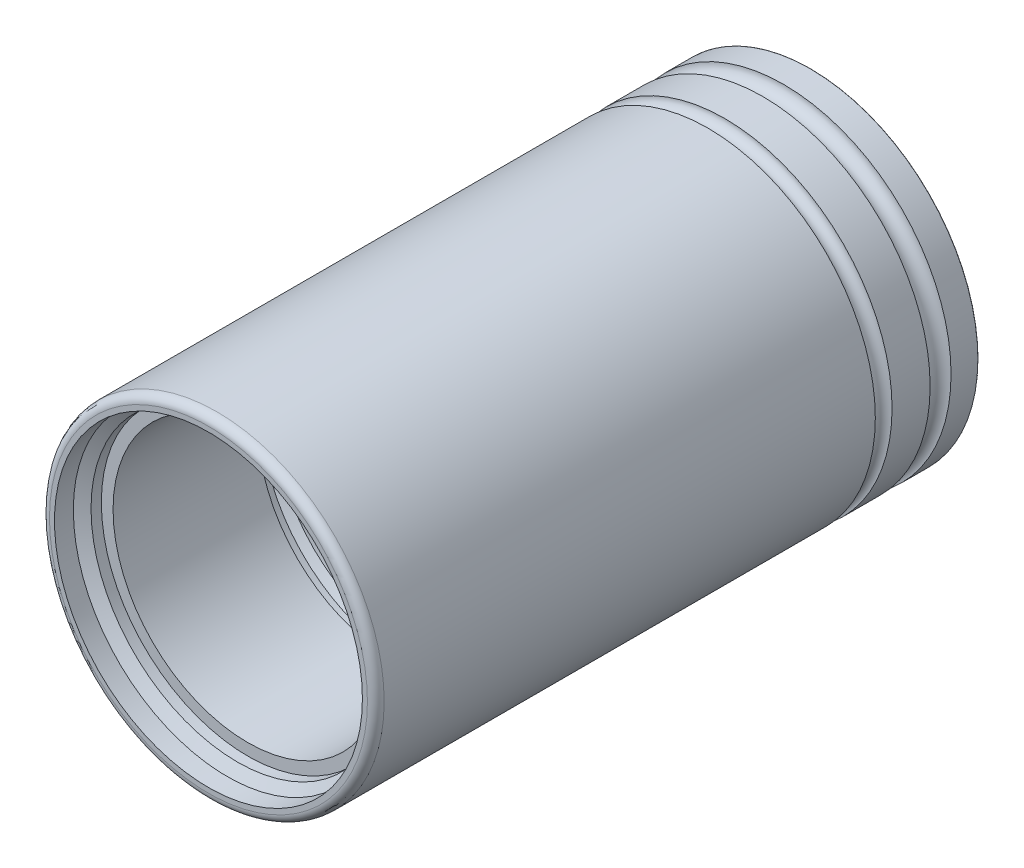
ISO-10303-21;
HEADER;
FILE_DESCRIPTION(('STEP AP214'),'2;1');
FILE_NAME('part.step','',(''),(''),'','','');
FILE_SCHEMA(('AUTOMOTIVE_DESIGN { 1 0 10303 214 1 1 1 1 }'));
ENDSEC;
DATA;
#1=APPLICATION_CONTEXT('core data for automotive mechanical design processes');
#2=APPLICATION_PROTOCOL_DEFINITION('international standard','automotive_design',2000,#1);
#3=PRODUCT_CONTEXT('',#1,'mechanical');
#4=PRODUCT('Part','Part','',(#3));
#5=PRODUCT_RELATED_PRODUCT_CATEGORY('part','',(#4));
#6=PRODUCT_DEFINITION_FORMATION('','',#4);
#7=PRODUCT_DEFINITION_CONTEXT('part definition',#1,'design');
#8=PRODUCT_DEFINITION('design','',#6,#7);
#9=PRODUCT_DEFINITION_SHAPE('','',#8);
#10=(LENGTH_UNIT() NAMED_UNIT(*) SI_UNIT(.MILLI.,.METRE.));
#11=(NAMED_UNIT(*) PLANE_ANGLE_UNIT() SI_UNIT($,.RADIAN.));
#12=(NAMED_UNIT(*) SI_UNIT($,.STERADIAN.) SOLID_ANGLE_UNIT());
#13=UNCERTAINTY_MEASURE_WITH_UNIT(LENGTH_MEASURE(1.E-05),#10,'distance_accuracy_value','');
#14=(GEOMETRIC_REPRESENTATION_CONTEXT(3) GLOBAL_UNCERTAINTY_ASSIGNED_CONTEXT((#13)) GLOBAL_UNIT_ASSIGNED_CONTEXT((#10,
#11,#12)) REPRESENTATION_CONTEXT('',''));
#15=CARTESIAN_POINT('',(0.,0.,0.));
#16=DIRECTION('',(0.,0.,1.));
#17=DIRECTION('',(1.,0.,0.));
#18=AXIS2_PLACEMENT_3D('',#15,#16,#17);
#19=CARTESIAN_POINT('',(0.,0.,-72.));
#20=DIRECTION('',(0.,0.,1.));
#21=DIRECTION('',(1.,0.,0.));
#22=AXIS2_PLACEMENT_3D('',#19,#20,#21);
#23=CYLINDRICAL_SURFACE('',#22,20.);
#24=CARTESIAN_POINT('',(0.,0.,-71.95));
#25=DIRECTION('',(0.,0.,1.));
#26=DIRECTION('',(1.,0.,0.));
#27=AXIS2_PLACEMENT_3D('',#24,#25,#26);
#28=CIRCLE('',#27,20.);
#29=CARTESIAN_POINT('',(20.,0.,-71.95));
#30=VERTEX_POINT('',#29);
#31=EDGE_CURVE('E46',#30,#30,#28,.T.);
#32=ORIENTED_EDGE('',*,*,#31,.T.);
#33=EDGE_LOOP('',(#32));
#34=FACE_BOUND('',#33,.T.);
#35=CARTESIAN_POINT('',(0.,0.,-68.75));
#36=DIRECTION('',(0.,0.,1.));
#37=DIRECTION('',(1.,0.,0.));
#38=AXIS2_PLACEMENT_3D('',#35,#36,#37);
#39=CIRCLE('',#38,20.);
#40=CARTESIAN_POINT('',(20.,0.,-68.75));
#41=VERTEX_POINT('',#40);
#42=EDGE_CURVE('E55',#41,#41,#39,.F.);
#43=ORIENTED_EDGE('',*,*,#42,.T.);
#44=EDGE_LOOP('',(#43));
#45=FACE_BOUND('',#44,.T.);
#46=ADVANCED_FACE('F33',(#34,#45),#23,.T.);
#47=CARTESIAN_POINT('',(0.,0.,-1.));
#48=DIRECTION('',(0.,0.,1.));
#49=DIRECTION('',(1.,0.,0.));
#50=AXIS2_PLACEMENT_3D('',#47,#48,#49);
#51=CIRCLE('',#50,20.);
#52=CARTESIAN_POINT('',(20.,0.,-1.));
#53=VERTEX_POINT('',#52);
#54=EDGE_CURVE('E159',#53,#53,#51,.F.);
#55=ORIENTED_EDGE('',*,*,#54,.T.);
#56=EDGE_LOOP('',(#55));
#57=FACE_BOUND('',#56,.T.);
#58=CARTESIAN_POINT('',(0.,0.,-59.7));
#59=DIRECTION('',(0.,0.,-1.));
#60=DIRECTION('',(-1.,0.,0.));
#61=AXIS2_PLACEMENT_3D('',#58,#59,#60);
#62=CIRCLE('',#61,20.);
#63=CARTESIAN_POINT('',(-20.,0.,-59.7));
#64=VERTEX_POINT('',#63);
#65=EDGE_CURVE('E53',#64,#64,#62,.F.);
#66=ORIENTED_EDGE('',*,*,#65,.T.);
#67=EDGE_LOOP('',(#66));
#68=FACE_BOUND('',#67,.T.);
#69=ADVANCED_FACE('F191',(#57,#68),#23,.T.);
#70=CARTESIAN_POINT('',(0.,0.,-72.));
#71=DIRECTION('',(0.,0.,1.));
#72=DIRECTION('',(1.,0.,0.));
#73=AXIS2_PLACEMENT_3D('',#70,#71,#72);
#74=PLANE('',#73);
#75=CARTESIAN_POINT('',(0.,0.,-72.));
#76=DIRECTION('',(0.,0.,1.));
#77=DIRECTION('',(1.,0.,0.));
#78=AXIS2_PLACEMENT_3D('',#75,#76,#77);
#79=CIRCLE('',#78,19.95);
#80=CARTESIAN_POINT('',(19.95,0.,-72.));
#81=VERTEX_POINT('',#80);
#82=EDGE_CURVE('E167',#81,#81,#79,.F.);
#83=ORIENTED_EDGE('',*,*,#82,.T.);
#84=EDGE_LOOP('',(#83));
#85=FACE_BOUND('',#84,.T.);
#86=CARTESIAN_POINT('',(0.,0.,-72.));
#87=DIRECTION('',(0.,0.,-1.));
#88=DIRECTION('',(-1.,0.,0.));
#89=AXIS2_PLACEMENT_3D('',#86,#87,#88);
#90=CIRCLE('',#89,15.95);
#91=CARTESIAN_POINT('',(-15.95,0.,-72.));
#92=VERTEX_POINT('',#91);
#93=EDGE_CURVE('E80',#92,#92,#90,.T.);
#94=ORIENTED_EDGE('',*,*,#93,.F.);
#95=EDGE_LOOP('',(#94));
#96=FACE_BOUND('',#95,.T.);
#97=ADVANCED_FACE('F197',(#85,#96),#74,.F.);
#98=CARTESIAN_POINT('',(0.,0.,-72.));
#99=DIRECTION('',(0.,0.,1.));
#100=DIRECTION('',(1.,0.,0.));
#101=AXIS2_PLACEMENT_3D('',#98,#99,#100);
#102=CIRCLE('',#101,10.8);
#103=CARTESIAN_POINT('',(10.8,0.,-72.));
#104=VERTEX_POINT('',#103);
#105=EDGE_CURVE('E170',#104,#104,#102,.T.);
#106=ORIENTED_EDGE('',*,*,#105,.T.);
#107=EDGE_LOOP('',(#106));
#108=FACE_BOUND('',#107,.T.);
#109=CARTESIAN_POINT('',(0.,0.,-72.));
#110=DIRECTION('',(0.,0.,-1.));
#111=DIRECTION('',(-1.,0.,0.));
#112=AXIS2_PLACEMENT_3D('',#109,#110,#111);
#113=CIRCLE('',#112,13.0475886032519);
#114=CARTESIAN_POINT('',(-13.0475886032519,0.,-72.));
#115=VERTEX_POINT('',#114);
#116=EDGE_CURVE('E60',#115,#115,#113,.T.);
#117=ORIENTED_EDGE('',*,*,#116,.T.);
#118=EDGE_LOOP('',(#117));
#119=FACE_BOUND('',#118,.T.);
#120=ADVANCED_FACE('F341',(#108,#119),#74,.F.);
#121=CARTESIAN_POINT('',(0.,0.,-72.));
#122=DIRECTION('',(0.,0.,-1.));
#123=DIRECTION('',(-1.,0.,0.));
#124=AXIS2_PLACEMENT_3D('',#121,#122,#123);
#125=CYLINDRICAL_SURFACE('',#124,17.5);
#126=CARTESIAN_POINT('',(0.,0.,-4.7));
#127=DIRECTION('',(0.,0.,-1.));
#128=DIRECTION('',(-1.,0.,0.));
#129=AXIS2_PLACEMENT_3D('',#126,#127,#128);
#130=CIRCLE('',#129,17.5);
#131=CARTESIAN_POINT('',(-17.5,0.,-4.7));
#132=VERTEX_POINT('',#131);
#133=EDGE_CURVE('E153',#132,#132,#130,.T.);
#134=ORIENTED_EDGE('',*,*,#133,.T.);
#135=EDGE_LOOP('',(#134));
#136=FACE_BOUND('',#135,.T.);
#137=CARTESIAN_POINT('',(0.,0.,-3.46602540378444));
#138=DIRECTION('',(0.,0.,1.));
#139=DIRECTION('',(1.,0.,0.));
#140=AXIS2_PLACEMENT_3D('',#137,#138,#139);
#141=CIRCLE('',#140,17.5);
#142=CARTESIAN_POINT('',(17.5,0.,-3.46602540378444));
#143=VERTEX_POINT('',#142);
#144=EDGE_CURVE('E90',#143,#143,#141,.T.);
#145=ORIENTED_EDGE('',*,*,#144,.T.);
#146=EDGE_LOOP('',(#145));
#147=FACE_BOUND('',#146,.T.);
#148=ADVANCED_FACE('F338',(#136,#147),#125,.F.);
#149=CARTESIAN_POINT('',(0.,0.,0.));
#150=DIRECTION('',(0.,0.,1.));
#151=DIRECTION('',(1.,0.,0.));
#152=AXIS2_PLACEMENT_3D('',#149,#150,#151);
#153=PLANE('',#152);
#154=CARTESIAN_POINT('',(0.,0.,0.));
#155=DIRECTION('',(0.,0.,1.));
#156=DIRECTION('',(1.,0.,0.));
#157=AXIS2_PLACEMENT_3D('',#154,#155,#156);
#158=CIRCLE('',#157,18.4);
#159=CARTESIAN_POINT('',(18.4,0.,0.));
#160=VERTEX_POINT('',#159);
#161=EDGE_CURVE('E83',#160,#160,#158,.T.);
#162=ORIENTED_EDGE('',*,*,#161,.F.);
#163=EDGE_LOOP('',(#162));
#164=FACE_BOUND('',#163,.T.);
#165=CARTESIAN_POINT('',(0.,0.,0.));
#166=DIRECTION('',(0.,0.,1.));
#167=DIRECTION('',(1.,0.,0.));
#168=AXIS2_PLACEMENT_3D('',#165,#166,#167);
#169=CIRCLE('',#168,19.);
#170=CARTESIAN_POINT('',(19.,0.,0.));
#171=VERTEX_POINT('',#170);
#172=EDGE_CURVE('E156',#171,#171,#169,.T.);
#173=ORIENTED_EDGE('',*,*,#172,.T.);
#174=EDGE_LOOP('',(#173));
#175=FACE_BOUND('',#174,.T.);
#176=ADVANCED_FACE('F336',(#164,#175),#153,.T.);
#177=CARTESIAN_POINT('',(0.,17.5,-4.7));
#178=DIRECTION('',(0.,0.,-1.));
#179=DIRECTION('',(-1.,0.,0.));
#180=AXIS2_PLACEMENT_3D('',#177,#178,#179);
#181=PLANE('',#180);
#182=ORIENTED_EDGE('',*,*,#133,.F.);
#183=EDGE_LOOP('',(#182));
#184=FACE_BOUND('',#183,.T.);
#185=CARTESIAN_POINT('',(0.,0.,-4.7));
#186=DIRECTION('',(0.,0.,-1.));
#187=DIRECTION('',(-1.,0.,0.));
#188=AXIS2_PLACEMENT_3D('',#185,#186,#187);
#189=CIRCLE('',#188,16.1);
#190=CARTESIAN_POINT('',(-16.1,0.,-4.7));
#191=VERTEX_POINT('',#190);
#192=EDGE_CURVE('E150',#191,#191,#189,.T.);
#193=ORIENTED_EDGE('',*,*,#192,.T.);
#194=EDGE_LOOP('',(#193));
#195=FACE_BOUND('',#194,.T.);
#196=ADVANCED_FACE('F332',(#184,#195),#181,.F.);
#197=CARTESIAN_POINT('',(0.,0.,-72.));
#198=DIRECTION('',(0.,0.,-1.));
#199=DIRECTION('',(-1.,0.,0.));
#200=AXIS2_PLACEMENT_3D('',#197,#198,#199);
#201=CYLINDRICAL_SURFACE('',#200,16.1);
#202=ORIENTED_EDGE('',*,*,#192,.F.);
#203=EDGE_LOOP('',(#202));
#204=FACE_BOUND('',#203,.T.);
#205=CARTESIAN_POINT('',(0.,0.,-22.));
#206=DIRECTION('',(0.,0.,-1.));
#207=DIRECTION('',(-1.,0.,0.));
#208=AXIS2_PLACEMENT_3D('',#205,#206,#207);
#209=CIRCLE('',#208,16.1);
#210=CARTESIAN_POINT('',(-16.1,0.,-22.));
#211=VERTEX_POINT('',#210);
#212=EDGE_CURVE('E147',#211,#211,#209,.T.);
#213=ORIENTED_EDGE('',*,*,#212,.T.);
#214=EDGE_LOOP('',(#213));
#215=FACE_BOUND('',#214,.T.);
#216=ADVANCED_FACE('F328',(#204,#215),#201,.F.);
#217=CARTESIAN_POINT('',(0.,16.1,-22.));
#218=DIRECTION('',(0.,0.,1.));
#219=DIRECTION('',(1.,0.,0.));
#220=AXIS2_PLACEMENT_3D('',#217,#218,#219);
#221=PLANE('',#220);
#222=ORIENTED_EDGE('',*,*,#212,.F.);
#223=EDGE_LOOP('',(#222));
#224=FACE_BOUND('',#223,.T.);
#225=CARTESIAN_POINT('',(0.,0.,-22.));
#226=DIRECTION('',(0.,0.,-1.));
#227=DIRECTION('',(-1.,0.,0.));
#228=AXIS2_PLACEMENT_3D('',#225,#226,#227);
#229=CIRCLE('',#228,17.1);
#230=CARTESIAN_POINT('',(-17.1,0.,-22.));
#231=VERTEX_POINT('',#230);
#232=EDGE_CURVE('E144',#231,#231,#229,.T.);
#233=ORIENTED_EDGE('',*,*,#232,.T.);
#234=EDGE_LOOP('',(#233));
#235=FACE_BOUND('',#234,.T.);
#236=ADVANCED_FACE('F324',(#224,#235),#221,.F.);
#237=CARTESIAN_POINT('',(0.,0.,-72.));
#238=DIRECTION('',(0.,0.,-1.));
#239=DIRECTION('',(-1.,0.,0.));
#240=AXIS2_PLACEMENT_3D('',#237,#238,#239);
#241=CYLINDRICAL_SURFACE('',#240,17.1);
#242=ORIENTED_EDGE('',*,*,#232,.F.);
#243=EDGE_LOOP('',(#242));
#244=FACE_BOUND('',#243,.T.);
#245=CARTESIAN_POINT('',(0.,0.,-23.4));
#246=DIRECTION('',(0.,0.,-1.));
#247=DIRECTION('',(-1.,0.,0.));
#248=AXIS2_PLACEMENT_3D('',#245,#246,#247);
#249=CIRCLE('',#248,17.1);
#250=CARTESIAN_POINT('',(-17.1,0.,-23.4));
#251=VERTEX_POINT('',#250);
#252=EDGE_CURVE('E141',#251,#251,#249,.T.);
#253=ORIENTED_EDGE('',*,*,#252,.T.);
#254=EDGE_LOOP('',(#253));
#255=FACE_BOUND('',#254,.T.);
#256=ADVANCED_FACE('F320',(#244,#255),#241,.F.);
#257=CARTESIAN_POINT('',(0.,0.,-23.9773502691896));
#258=DIRECTION('',(0.,0.,1.));
#259=DIRECTION('',(1.,0.,0.));
#260=AXIS2_PLACEMENT_3D('',#257,#258,#259);
#261=CONICAL_SURFACE('',#260,16.1,1.0471975511966);
#262=ORIENTED_EDGE('',*,*,#252,.F.);
#263=EDGE_LOOP('',(#262));
#264=FACE_BOUND('',#263,.T.);
#265=CARTESIAN_POINT('',(0.,0.,-23.9773502691896));
#266=DIRECTION('',(0.,0.,-1.));
#267=DIRECTION('',(-1.,0.,0.));
#268=AXIS2_PLACEMENT_3D('',#265,#266,#267);
#269=CIRCLE('',#268,16.1);
#270=CARTESIAN_POINT('',(-16.1,0.,-23.9773502691896));
#271=VERTEX_POINT('',#270);
#272=EDGE_CURVE('E138',#271,#271,#269,.T.);
#273=ORIENTED_EDGE('',*,*,#272,.T.);
#274=EDGE_LOOP('',(#273));
#275=FACE_BOUND('',#274,.T.);
#276=ADVANCED_FACE('F316',(#264,#275),#261,.F.);
#277=CARTESIAN_POINT('',(0.,0.,-72.));
#278=DIRECTION('',(0.,0.,-1.));
#279=DIRECTION('',(-1.,0.,0.));
#280=AXIS2_PLACEMENT_3D('',#277,#278,#279);
#281=CYLINDRICAL_SURFACE('',#280,16.1);
#282=ORIENTED_EDGE('',*,*,#272,.F.);
#283=EDGE_LOOP('',(#282));
#284=FACE_BOUND('',#283,.T.);
#285=CARTESIAN_POINT('',(0.,0.,-30.3));
#286=DIRECTION('',(0.,0.,-1.));
#287=DIRECTION('',(-1.,0.,0.));
#288=AXIS2_PLACEMENT_3D('',#285,#286,#287);
#289=CIRCLE('',#288,16.1);
#290=CARTESIAN_POINT('',(-16.1,0.,-30.3));
#291=VERTEX_POINT('',#290);
#292=EDGE_CURVE('E135',#291,#291,#289,.T.);
#293=ORIENTED_EDGE('',*,*,#292,.T.);
#294=EDGE_LOOP('',(#293));
#295=FACE_BOUND('',#294,.T.);
#296=ADVANCED_FACE('F312',(#284,#295),#281,.F.);
#297=CARTESIAN_POINT('',(0.,16.1,-30.3));
#298=DIRECTION('',(0.,0.,1.));
#299=DIRECTION('',(1.,0.,0.));
#300=AXIS2_PLACEMENT_3D('',#297,#298,#299);
#301=PLANE('',#300);
#302=ORIENTED_EDGE('',*,*,#292,.F.);
#303=EDGE_LOOP('',(#302));
#304=FACE_BOUND('',#303,.T.);
#305=CARTESIAN_POINT('',(0.,0.,-30.3));
#306=DIRECTION('',(0.,0.,-1.));
#307=DIRECTION('',(-1.,0.,0.));
#308=AXIS2_PLACEMENT_3D('',#305,#306,#307);
#309=CIRCLE('',#308,18.);
#310=CARTESIAN_POINT('',(-18.,0.,-30.3));
#311=VERTEX_POINT('',#310);
#312=EDGE_CURVE('E132',#311,#311,#309,.T.);
#313=ORIENTED_EDGE('',*,*,#312,.T.);
#314=EDGE_LOOP('',(#313));
#315=FACE_BOUND('',#314,.T.);
#316=ADVANCED_FACE('F308',(#304,#315),#301,.F.);
#317=CARTESIAN_POINT('',(0.,0.,-72.));
#318=DIRECTION('',(0.,0.,-1.));
#319=DIRECTION('',(-1.,0.,0.));
#320=AXIS2_PLACEMENT_3D('',#317,#318,#319);
#321=CYLINDRICAL_SURFACE('',#320,18.);
#322=ORIENTED_EDGE('',*,*,#312,.F.);
#323=EDGE_LOOP('',(#322));
#324=FACE_BOUND('',#323,.T.);
#325=CARTESIAN_POINT('',(0.,0.,-33.5));
#326=DIRECTION('',(0.,0.,-1.));
#327=DIRECTION('',(-1.,0.,0.));
#328=AXIS2_PLACEMENT_3D('',#325,#326,#327);
#329=CIRCLE('',#328,18.);
#330=CARTESIAN_POINT('',(-18.,0.,-33.5));
#331=VERTEX_POINT('',#330);
#332=EDGE_CURVE('E129',#331,#331,#329,.T.);
#333=ORIENTED_EDGE('',*,*,#332,.T.);
#334=EDGE_LOOP('',(#333));
#335=FACE_BOUND('',#334,.T.);
#336=ADVANCED_FACE('F304',(#324,#335),#321,.F.);
#337=CARTESIAN_POINT('',(0.,16.1,-33.5));
#338=DIRECTION('',(0.,0.,-1.));
#339=DIRECTION('',(-1.,0.,0.));
#340=AXIS2_PLACEMENT_3D('',#337,#338,#339);
#341=PLANE('',#340);
#342=ORIENTED_EDGE('',*,*,#332,.F.);
#343=EDGE_LOOP('',(#342));
#344=FACE_BOUND('',#343,.T.);
#345=CARTESIAN_POINT('',(0.,0.,-33.5));
#346=DIRECTION('',(0.,0.,-1.));
#347=DIRECTION('',(-1.,0.,0.));
#348=AXIS2_PLACEMENT_3D('',#345,#346,#347);
#349=CIRCLE('',#348,16.1);
#350=CARTESIAN_POINT('',(-16.1,0.,-33.5));
#351=VERTEX_POINT('',#350);
#352=EDGE_CURVE('E126',#351,#351,#349,.T.);
#353=ORIENTED_EDGE('',*,*,#352,.T.);
#354=EDGE_LOOP('',(#353));
#355=FACE_BOUND('',#354,.T.);
#356=ADVANCED_FACE('F300',(#344,#355),#341,.F.);
#357=CARTESIAN_POINT('',(0.,0.,-72.));
#358=DIRECTION('',(0.,0.,-1.));
#359=DIRECTION('',(-1.,0.,0.));
#360=AXIS2_PLACEMENT_3D('',#357,#358,#359);
#361=CYLINDRICAL_SURFACE('',#360,16.1);
#362=ORIENTED_EDGE('',*,*,#352,.F.);
#363=EDGE_LOOP('',(#362));
#364=FACE_BOUND('',#363,.T.);
#365=CARTESIAN_POINT('',(0.,0.,-47.));
#366=DIRECTION('',(0.,0.,-1.));
#367=DIRECTION('',(-1.,0.,0.));
#368=AXIS2_PLACEMENT_3D('',#365,#366,#367);
#369=CIRCLE('',#368,16.1);
#370=CARTESIAN_POINT('',(-16.1,0.,-47.));
#371=VERTEX_POINT('',#370);
#372=EDGE_CURVE('E123',#371,#371,#369,.T.);
#373=ORIENTED_EDGE('',*,*,#372,.T.);
#374=EDGE_LOOP('',(#373));
#375=FACE_BOUND('',#374,.T.);
#376=ADVANCED_FACE('F296',(#364,#375),#361,.F.);
#377=CARTESIAN_POINT('',(0.,16.1,-47.));
#378=DIRECTION('',(0.,0.,-1.));
#379=DIRECTION('',(-1.,0.,0.));
#380=AXIS2_PLACEMENT_3D('',#377,#378,#379);
#381=PLANE('',#380);
#382=ORIENTED_EDGE('',*,*,#372,.F.);
#383=EDGE_LOOP('',(#382));
#384=FACE_BOUND('',#383,.T.);
#385=CARTESIAN_POINT('',(0.,0.,-47.));
#386=DIRECTION('',(0.,0.,-1.));
#387=DIRECTION('',(-1.,0.,0.));
#388=AXIS2_PLACEMENT_3D('',#385,#386,#387);
#389=CIRCLE('',#388,6.);
#390=CARTESIAN_POINT('',(-6.,0.,-47.));
#391=VERTEX_POINT('',#390);
#392=EDGE_CURVE('E120',#391,#391,#389,.T.);
#393=ORIENTED_EDGE('',*,*,#392,.T.);
#394=EDGE_LOOP('',(#393));
#395=FACE_BOUND('',#394,.T.);
#396=ADVANCED_FACE('F292',(#384,#395),#381,.F.);
#397=CARTESIAN_POINT('',(0.,0.,-72.));
#398=DIRECTION('',(0.,0.,-1.));
#399=DIRECTION('',(-1.,0.,0.));
#400=AXIS2_PLACEMENT_3D('',#397,#398,#399);
#401=CYLINDRICAL_SURFACE('',#400,6.);
#402=CARTESIAN_POINT('',(0.,0.,-48.95));
#403=DIRECTION('',(0.,0.,1.));
#404=DIRECTION('',(1.,0.,0.));
#405=AXIS2_PLACEMENT_3D('',#402,#403,#404);
#406=CIRCLE('',#405,6.);
#407=CARTESIAN_POINT('',(6.,0.,-48.95));
#408=VERTEX_POINT('',#407);
#409=EDGE_CURVE('E41',#408,#408,#406,.F.);
#410=ORIENTED_EDGE('',*,*,#409,.T.);
#411=EDGE_LOOP('',(#410));
#412=FACE_BOUND('',#411,.T.);
#413=ORIENTED_EDGE('',*,*,#392,.F.);
#414=EDGE_LOOP('',(#413));
#415=FACE_BOUND('',#414,.T.);
#416=ADVANCED_FACE('F289',(#412,#415),#401,.F.);
#417=CARTESIAN_POINT('',(0.,6.,-49.));
#418=DIRECTION('',(0.,0.,1.));
#419=DIRECTION('',(1.,0.,0.));
#420=AXIS2_PLACEMENT_3D('',#417,#418,#419);
#421=PLANE('',#420);
#422=CARTESIAN_POINT('',(0.,0.,-49.));
#423=DIRECTION('',(0.,0.,1.));
#424=DIRECTION('',(1.,0.,0.));
#425=AXIS2_PLACEMENT_3D('',#422,#423,#424);
#426=CIRCLE('',#425,6.05);
#427=CARTESIAN_POINT('',(6.05,0.,-49.));
#428=VERTEX_POINT('',#427);
#429=EDGE_CURVE('E10',#428,#428,#426,.T.);
#430=ORIENTED_EDGE('',*,*,#429,.T.);
#431=EDGE_LOOP('',(#430));
#432=FACE_BOUND('',#431,.T.);
#433=CARTESIAN_POINT('',(0.,0.,-49.));
#434=DIRECTION('',(0.,0.,-1.));
#435=DIRECTION('',(-1.,0.,0.));
#436=AXIS2_PLACEMENT_3D('',#433,#434,#435);
#437=CIRCLE('',#436,9.5);
#438=CARTESIAN_POINT('',(-9.5,0.,-49.));
#439=VERTEX_POINT('',#438);
#440=EDGE_CURVE('E117',#439,#439,#437,.T.);
#441=ORIENTED_EDGE('',*,*,#440,.T.);
#442=EDGE_LOOP('',(#441));
#443=FACE_BOUND('',#442,.T.);
#444=ADVANCED_FACE('F285',(#432,#443),#421,.F.);
#445=CARTESIAN_POINT('',(0.,0.,-72.));
#446=DIRECTION('',(0.,0.,-1.));
#447=DIRECTION('',(-1.,0.,0.));
#448=AXIS2_PLACEMENT_3D('',#445,#446,#447);
#449=CYLINDRICAL_SURFACE('',#448,9.5);
#450=ORIENTED_EDGE('',*,*,#440,.F.);
#451=EDGE_LOOP('',(#450));
#452=FACE_BOUND('',#451,.T.);
#453=CARTESIAN_POINT('',(0.,0.,-52.8));
#454=DIRECTION('',(0.,0.,-1.));
#455=DIRECTION('',(-1.,0.,0.));
#456=AXIS2_PLACEMENT_3D('',#453,#454,#455);
#457=CIRCLE('',#456,9.5);
#458=CARTESIAN_POINT('',(-9.5,0.,-52.8));
#459=VERTEX_POINT('',#458);
#460=EDGE_CURVE('E114',#459,#459,#457,.T.);
#461=ORIENTED_EDGE('',*,*,#460,.T.);
#462=EDGE_LOOP('',(#461));
#463=FACE_BOUND('',#462,.T.);
#464=ADVANCED_FACE('F281',(#452,#463),#449,.F.);
#465=CARTESIAN_POINT('',(0.,0.,-53.4));
#466=DIRECTION('',(0.,0.,-1.));
#467=DIRECTION('',(-1.,0.,0.));
#468=AXIS2_PLACEMENT_3D('',#465,#466,#467);
#469=TOROIDAL_SURFACE('',#468,9.5,0.600000000000003);
#470=ORIENTED_EDGE('',*,*,#460,.F.);
#471=EDGE_LOOP('',(#470));
#472=FACE_BOUND('',#471,.T.);
#473=CARTESIAN_POINT('',(0.,0.,-54.));
#474=DIRECTION('',(0.,0.,-1.));
#475=DIRECTION('',(-1.,0.,0.));
#476=AXIS2_PLACEMENT_3D('',#473,#474,#475);
#477=CIRCLE('',#476,9.5);
#478=CARTESIAN_POINT('',(-9.5,0.,-54.));
#479=VERTEX_POINT('',#478);
#480=EDGE_CURVE('E111',#479,#479,#477,.T.);
#481=ORIENTED_EDGE('',*,*,#480,.T.);
#482=EDGE_LOOP('',(#481));
#483=FACE_BOUND('',#482,.T.);
#484=ADVANCED_FACE('F277',(#472,#483),#469,.F.);
#485=CARTESIAN_POINT('',(0.,0.,-72.));
#486=DIRECTION('',(0.,0.,-1.));
#487=DIRECTION('',(-1.,0.,0.));
#488=AXIS2_PLACEMENT_3D('',#485,#486,#487);
#489=CYLINDRICAL_SURFACE('',#488,9.5);
#490=ORIENTED_EDGE('',*,*,#480,.F.);
#491=EDGE_LOOP('',(#490));
#492=FACE_BOUND('',#491,.T.);
#493=CARTESIAN_POINT('',(0.,0.,-55.5));
#494=DIRECTION('',(0.,0.,-1.));
#495=DIRECTION('',(-1.,0.,0.));
#496=AXIS2_PLACEMENT_3D('',#493,#494,#495);
#497=CIRCLE('',#496,9.5);
#498=CARTESIAN_POINT('',(-9.5,0.,-55.5));
#499=VERTEX_POINT('',#498);
#500=EDGE_CURVE('E108',#499,#499,#497,.T.);
#501=ORIENTED_EDGE('',*,*,#500,.T.);
#502=EDGE_LOOP('',(#501));
#503=FACE_BOUND('',#502,.T.);
#504=ADVANCED_FACE('F273',(#492,#503),#489,.F.);
#505=CARTESIAN_POINT('',(0.,9.5,-55.5));
#506=DIRECTION('',(0.,0.,1.));
#507=DIRECTION('',(1.,0.,0.));
#508=AXIS2_PLACEMENT_3D('',#505,#506,#507);
#509=PLANE('',#508);
#510=ORIENTED_EDGE('',*,*,#500,.F.);
#511=EDGE_LOOP('',(#510));
#512=FACE_BOUND('',#511,.T.);
#513=CARTESIAN_POINT('',(0.,0.,-55.5));
#514=DIRECTION('',(0.,0.,-1.));
#515=DIRECTION('',(-1.,0.,0.));
#516=AXIS2_PLACEMENT_3D('',#513,#514,#515);
#517=CIRCLE('',#516,10.75);
#518=CARTESIAN_POINT('',(-10.75,0.,-55.5));
#519=VERTEX_POINT('',#518);
#520=EDGE_CURVE('E105',#519,#519,#517,.T.);
#521=ORIENTED_EDGE('',*,*,#520,.T.);
#522=EDGE_LOOP('',(#521));
#523=FACE_BOUND('',#522,.T.);
#524=ADVANCED_FACE('F269',(#512,#523),#509,.F.);
#525=CARTESIAN_POINT('',(0.,0.,-72.));
#526=DIRECTION('',(0.,0.,-1.));
#527=DIRECTION('',(-1.,0.,0.));
#528=AXIS2_PLACEMENT_3D('',#525,#526,#527);
#529=CYLINDRICAL_SURFACE('',#528,10.75);
#530=ORIENTED_EDGE('',*,*,#520,.F.);
#531=EDGE_LOOP('',(#530));
#532=FACE_BOUND('',#531,.T.);
#533=CARTESIAN_POINT('',(0.,0.,-67.));
#534=DIRECTION('',(0.,0.,-1.));
#535=DIRECTION('',(-1.,0.,0.));
#536=AXIS2_PLACEMENT_3D('',#533,#534,#535);
#537=CIRCLE('',#536,10.75);
#538=CARTESIAN_POINT('',(-10.75,0.,-67.));
#539=VERTEX_POINT('',#538);
#540=EDGE_CURVE('E102',#539,#539,#537,.T.);
#541=ORIENTED_EDGE('',*,*,#540,.T.);
#542=EDGE_LOOP('',(#541));
#543=FACE_BOUND('',#542,.T.);
#544=ADVANCED_FACE('F265',(#532,#543),#529,.F.);
#545=CARTESIAN_POINT('',(0.,10.75,-67.));
#546=DIRECTION('',(0.,0.,1.));
#547=DIRECTION('',(1.,0.,0.));
#548=AXIS2_PLACEMENT_3D('',#545,#546,#547);
#549=PLANE('',#548);
#550=ORIENTED_EDGE('',*,*,#540,.F.);
#551=EDGE_LOOP('',(#550));
#552=FACE_BOUND('',#551,.T.);
#553=CARTESIAN_POINT('',(0.,0.,-67.));
#554=DIRECTION('',(0.,0.,-1.));
#555=DIRECTION('',(-1.,0.,0.));
#556=AXIS2_PLACEMENT_3D('',#553,#554,#555);
#557=CIRCLE('',#556,12.4);
#558=CARTESIAN_POINT('',(-12.4,0.,-67.));
#559=VERTEX_POINT('',#558);
#560=EDGE_CURVE('E99',#559,#559,#557,.T.);
#561=ORIENTED_EDGE('',*,*,#560,.T.);
#562=EDGE_LOOP('',(#561));
#563=FACE_BOUND('',#562,.T.);
#564=ADVANCED_FACE('F261',(#552,#563),#549,.F.);
#565=CARTESIAN_POINT('',(0.,0.,-72.));
#566=DIRECTION('',(0.,0.,-1.));
#567=DIRECTION('',(-1.,0.,0.));
#568=AXIS2_PLACEMENT_3D('',#565,#566,#567);
#569=CYLINDRICAL_SURFACE('',#568,12.4);
#570=ORIENTED_EDGE('',*,*,#560,.F.);
#571=EDGE_LOOP('',(#570));
#572=FACE_BOUND('',#571,.T.);
#573=CARTESIAN_POINT('',(0.,0.,-70.));
#574=DIRECTION('',(0.,0.,-1.));
#575=DIRECTION('',(-1.,0.,0.));
#576=AXIS2_PLACEMENT_3D('',#573,#574,#575);
#577=CIRCLE('',#576,12.4);
#578=CARTESIAN_POINT('',(-12.4,0.,-70.));
#579=VERTEX_POINT('',#578);
#580=EDGE_CURVE('E96',#579,#579,#577,.T.);
#581=ORIENTED_EDGE('',*,*,#580,.T.);
#582=EDGE_LOOP('',(#581));
#583=FACE_BOUND('',#582,.T.);
#584=ADVANCED_FACE('F257',(#572,#583),#569,.F.);
#585=CARTESIAN_POINT('',(0.,12.4,-70.));
#586=DIRECTION('',(0.,0.,-1.));
#587=DIRECTION('',(-1.,0.,0.));
#588=AXIS2_PLACEMENT_3D('',#585,#586,#587);
#589=PLANE('',#588);
#590=ORIENTED_EDGE('',*,*,#580,.F.);
#591=EDGE_LOOP('',(#590));
#592=FACE_BOUND('',#591,.T.);
#593=CARTESIAN_POINT('',(0.,0.,-70.));
#594=DIRECTION('',(0.,0.,-1.));
#595=DIRECTION('',(-1.,0.,0.));
#596=AXIS2_PLACEMENT_3D('',#593,#594,#595);
#597=CIRCLE('',#596,10.75);
#598=CARTESIAN_POINT('',(-10.75,0.,-70.));
#599=VERTEX_POINT('',#598);
#600=EDGE_CURVE('E93',#599,#599,#597,.T.);
#601=ORIENTED_EDGE('',*,*,#600,.T.);
#602=EDGE_LOOP('',(#601));
#603=FACE_BOUND('',#602,.T.);
#604=ADVANCED_FACE('F253',(#592,#603),#589,.F.);
#605=CARTESIAN_POINT('',(0.,0.,-72.));
#606=DIRECTION('',(0.,0.,-1.));
#607=DIRECTION('',(-1.,0.,0.));
#608=AXIS2_PLACEMENT_3D('',#605,#606,#607);
#609=CYLINDRICAL_SURFACE('',#608,10.75);
#610=CARTESIAN_POINT('',(0.,0.,-71.95));
#611=DIRECTION('',(0.,0.,1.));
#612=DIRECTION('',(1.,0.,0.));
#613=AXIS2_PLACEMENT_3D('',#610,#611,#612);
#614=CIRCLE('',#613,10.75);
#615=CARTESIAN_POINT('',(10.75,0.,-71.95));
#616=VERTEX_POINT('',#615);
#617=EDGE_CURVE('E162',#616,#616,#614,.F.);
#618=ORIENTED_EDGE('',*,*,#617,.T.);
#619=EDGE_LOOP('',(#618));
#620=FACE_BOUND('',#619,.T.);
#621=ORIENTED_EDGE('',*,*,#600,.F.);
#622=EDGE_LOOP('',(#621));
#623=FACE_BOUND('',#622,.T.);
#624=ADVANCED_FACE('F249',(#620,#623),#609,.F.);
#625=CARTESIAN_POINT('',(0.,0.,-3.46602540378444));
#626=DIRECTION('',(0.,0.,1.));
#627=DIRECTION('',(1.,0.,0.));
#628=AXIS2_PLACEMENT_3D('',#625,#626,#627);
#629=CONICAL_SURFACE('',#628,17.5,1.0471975511966);
#630=CARTESIAN_POINT('',(0.,0.,-2.6));
#631=DIRECTION('',(0.,0.,1.));
#632=DIRECTION('',(1.,0.,0.));
#633=AXIS2_PLACEMENT_3D('',#630,#631,#632);
#634=CIRCLE('',#633,19.);
#635=CARTESIAN_POINT('',(19.,0.,-2.6));
#636=VERTEX_POINT('',#635);
#637=EDGE_CURVE('E87',#636,#636,#634,.T.);
#638=ORIENTED_EDGE('',*,*,#637,.T.);
#639=EDGE_LOOP('',(#638));
#640=FACE_BOUND('',#639,.T.);
#641=ORIENTED_EDGE('',*,*,#144,.F.);
#642=EDGE_LOOP('',(#641));
#643=FACE_BOUND('',#642,.T.);
#644=ADVANCED_FACE('F245',(#640,#643),#629,.F.);
#645=CARTESIAN_POINT('',(0.,0.,-2.6));
#646=DIRECTION('',(0.,0.,-1.));
#647=DIRECTION('',(-1.,0.,0.));
#648=AXIS2_PLACEMENT_3D('',#645,#646,#647);
#649=CONICAL_SURFACE('',#648,19.,1.0471975511966);
#650=CARTESIAN_POINT('',(0.,0.,-2.25358983848623));
#651=DIRECTION('',(0.,0.,-1.));
#652=DIRECTION('',(-1.,0.,0.));
#653=AXIS2_PLACEMENT_3D('',#650,#651,#652);
#654=CIRCLE('',#653,18.4);
#655=CARTESIAN_POINT('',(-18.4,0.,-2.25358983848623));
#656=VERTEX_POINT('',#655);
#657=EDGE_CURVE('E86',#656,#656,#654,.T.);
#658=ORIENTED_EDGE('',*,*,#657,.F.);
#659=EDGE_LOOP('',(#658));
#660=FACE_BOUND('',#659,.T.);
#661=ORIENTED_EDGE('',*,*,#637,.F.);
#662=EDGE_LOOP('',(#661));
#663=FACE_BOUND('',#662,.T.);
#664=ADVANCED_FACE('F242',(#660,#663),#649,.F.);
#665=CARTESIAN_POINT('',(0.,0.,-1.));
#666=DIRECTION('',(0.,0.,1.));
#667=DIRECTION('',(1.,0.,0.));
#668=AXIS2_PLACEMENT_3D('',#665,#666,#667);
#669=TOROIDAL_SURFACE('',#668,19.,1.);
#670=ORIENTED_EDGE('',*,*,#54,.F.);
#671=EDGE_LOOP('',(#670));
#672=FACE_BOUND('',#671,.T.);
#673=ORIENTED_EDGE('',*,*,#172,.F.);
#674=EDGE_LOOP('',(#673));
#675=FACE_BOUND('',#674,.T.);
#676=ADVANCED_FACE('F240',(#672,#675),#669,.T.);
#677=CARTESIAN_POINT('',(0.,0.,-2.6));
#678=DIRECTION('',(0.,0.,1.));
#679=DIRECTION('',(1.,0.,0.));
#680=AXIS2_PLACEMENT_3D('',#677,#678,#679);
#681=CYLINDRICAL_SURFACE('',#680,18.4);
#682=ORIENTED_EDGE('',*,*,#657,.T.);
#683=EDGE_LOOP('',(#682));
#684=FACE_BOUND('',#683,.T.);
#685=ORIENTED_EDGE('',*,*,#161,.T.);
#686=EDGE_LOOP('',(#685));
#687=FACE_BOUND('',#686,.T.);
#688=ADVANCED_FACE('F186',(#684,#687),#681,.F.);
#689=CARTESIAN_POINT('',(0.,0.,-71.95));
#690=DIRECTION('',(0.,0.,1.));
#691=DIRECTION('',(1.,0.,0.));
#692=AXIS2_PLACEMENT_3D('',#689,#690,#691);
#693=TOROIDAL_SURFACE('',#692,10.8,0.05);
#694=ORIENTED_EDGE('',*,*,#105,.F.);
#695=EDGE_LOOP('',(#694));
#696=FACE_BOUND('',#695,.T.);
#697=ORIENTED_EDGE('',*,*,#617,.F.);
#698=EDGE_LOOP('',(#697));
#699=FACE_BOUND('',#698,.T.);
#700=ADVANCED_FACE('F178',(#696,#699),#693,.T.);
#701=CARTESIAN_POINT('',(0.,0.,-71.95));
#702=DIRECTION('',(0.,0.,1.));
#703=DIRECTION('',(1.,0.,0.));
#704=AXIS2_PLACEMENT_3D('',#701,#702,#703);
#705=TOROIDAL_SURFACE('',#704,19.95,0.05);
#706=ORIENTED_EDGE('',*,*,#82,.F.);
#707=EDGE_LOOP('',(#706));
#708=FACE_BOUND('',#707,.T.);
#709=ORIENTED_EDGE('',*,*,#31,.F.);
#710=EDGE_LOOP('',(#709));
#711=FACE_BOUND('',#710,.T.);
#712=ADVANCED_FACE('F176',(#708,#711),#705,.T.);
#713=CARTESIAN_POINT('',(0.,0.,-48.95));
#714=DIRECTION('',(0.,0.,1.));
#715=DIRECTION('',(1.,0.,0.));
#716=AXIS2_PLACEMENT_3D('',#713,#714,#715);
#717=TOROIDAL_SURFACE('',#716,6.05,0.05);
#718=ORIENTED_EDGE('',*,*,#429,.F.);
#719=EDGE_LOOP('',(#718));
#720=FACE_BOUND('',#719,.T.);
#721=ORIENTED_EDGE('',*,*,#409,.F.);
#722=EDGE_LOOP('',(#721));
#723=FACE_BOUND('',#722,.T.);
#724=ADVANCED_FACE('F35',(#720,#723),#717,.T.);
#725=CARTESIAN_POINT('',(0.,0.,-88.9588759333788));
#726=DIRECTION('',(0.,0.,-1.));
#727=DIRECTION('',(-1.,0.,0.));
#728=AXIS2_PLACEMENT_3D('',#725,#726,#727);
#729=CYLINDRICAL_SURFACE('',#728,15.95);
#730=ORIENTED_EDGE('',*,*,#93,.T.);
#731=EDGE_LOOP('',(#730));
#732=FACE_BOUND('',#731,.T.);
#733=CARTESIAN_POINT('',(0.,0.,-72.8983506963827));
#734=DIRECTION('',(0.,0.,-1.));
#735=DIRECTION('',(-1.,0.,0.));
#736=AXIS2_PLACEMENT_3D('',#733,#734,#735);
#737=CIRCLE('',#736,15.95);
#738=CARTESIAN_POINT('',(-15.95,0.,-72.8983506963827));
#739=VERTEX_POINT('',#738);
#740=EDGE_CURVE('E77',#739,#739,#737,.T.);
#741=ORIENTED_EDGE('',*,*,#740,.F.);
#742=EDGE_LOOP('',(#741));
#743=FACE_BOUND('',#742,.T.);
#744=ADVANCED_FACE('F184',(#732,#743),#729,.T.);
#745=CARTESIAN_POINT('',(0.,0.,-72.8983506963827));
#746=DIRECTION('',(0.,0.,-1.));
#747=DIRECTION('',(-1.,0.,0.));
#748=AXIS2_PLACEMENT_3D('',#745,#746,#747);
#749=TOROIDAL_SURFACE('',#748,14.95,1.);
#750=ORIENTED_EDGE('',*,*,#740,.T.);
#751=EDGE_LOOP('',(#750));
#752=FACE_BOUND('',#751,.T.);
#753=CARTESIAN_POINT('',(0.,0.,-73.8983506963827));
#754=DIRECTION('',(0.,0.,-1.));
#755=DIRECTION('',(-1.,0.,0.));
#756=AXIS2_PLACEMENT_3D('',#753,#754,#755);
#757=CIRCLE('',#756,14.95);
#758=CARTESIAN_POINT('',(-14.95,0.,-73.8983506963827));
#759=VERTEX_POINT('',#758);
#760=EDGE_CURVE('E74',#759,#759,#757,.T.);
#761=ORIENTED_EDGE('',*,*,#760,.F.);
#762=EDGE_LOOP('',(#761));
#763=FACE_BOUND('',#762,.T.);
#764=ADVANCED_FACE('F230',(#752,#763),#749,.T.);
#765=CARTESIAN_POINT('',(-14.5,0.,-73.8983506963827));
#766=DIRECTION('',(0.,0.,-1.));
#767=DIRECTION('',(-1.,0.,0.));
#768=AXIS2_PLACEMENT_3D('',#765,#766,#767);
#769=PLANE('',#768);
#770=ORIENTED_EDGE('',*,*,#760,.T.);
#771=EDGE_LOOP('',(#770));
#772=FACE_BOUND('',#771,.T.);
#773=CARTESIAN_POINT('',(0.,0.,-73.8983506963827));
#774=DIRECTION('',(0.,0.,-1.));
#775=DIRECTION('',(-1.,0.,0.));
#776=AXIS2_PLACEMENT_3D('',#773,#774,#775);
#777=CIRCLE('',#776,14.0475886032519);
#778=CARTESIAN_POINT('',(-14.0475886032519,0.,-73.8983506963827));
#779=VERTEX_POINT('',#778);
#780=EDGE_CURVE('E69',#779,#779,#777,.T.);
#781=ORIENTED_EDGE('',*,*,#780,.F.);
#782=EDGE_LOOP('',(#781));
#783=FACE_BOUND('',#782,.T.);
#784=ADVANCED_FACE('F226',(#772,#783),#769,.T.);
#785=CARTESIAN_POINT('',(0.,0.,-72.8983506963827));
#786=DIRECTION('',(0.,0.,-1.));
#787=DIRECTION('',(-1.,0.,0.));
#788=AXIS2_PLACEMENT_3D('',#785,#786,#787);
#789=TOROIDAL_SURFACE('',#788,14.0475886032519,1.);
#790=ORIENTED_EDGE('',*,*,#780,.T.);
#791=EDGE_LOOP('',(#790));
#792=FACE_BOUND('',#791,.T.);
#793=CARTESIAN_POINT('',(0.,0.,-72.8983506963827));
#794=DIRECTION('',(0.,0.,-1.));
#795=DIRECTION('',(-1.,0.,0.));
#796=AXIS2_PLACEMENT_3D('',#793,#794,#795);
#797=CIRCLE('',#796,13.0475886032519);
#798=CARTESIAN_POINT('',(-13.0475886032519,0.,-72.8983506963827));
#799=VERTEX_POINT('',#798);
#800=EDGE_CURVE('E64',#799,#799,#797,.T.);
#801=ORIENTED_EDGE('',*,*,#800,.F.);
#802=EDGE_LOOP('',(#801));
#803=FACE_BOUND('',#802,.T.);
#804=ADVANCED_FACE('F219',(#792,#803),#789,.T.);
#805=CARTESIAN_POINT('',(0.,0.,-88.9588759333788));
#806=DIRECTION('',(0.,0.,-1.));
#807=DIRECTION('',(-1.,0.,0.));
#808=AXIS2_PLACEMENT_3D('',#805,#806,#807);
#809=CYLINDRICAL_SURFACE('',#808,13.0475886032519);
#810=ORIENTED_EDGE('',*,*,#800,.T.);
#811=EDGE_LOOP('',(#810));
#812=FACE_BOUND('',#811,.T.);
#813=ORIENTED_EDGE('',*,*,#116,.F.);
#814=EDGE_LOOP('',(#813));
#815=FACE_BOUND('',#814,.T.);
#816=ADVANCED_FACE('F213',(#812,#815),#809,.F.);
#817=CARTESIAN_POINT('',(0.,0.,-60.7));
#818=DIRECTION('',(0.,0.,1.));
#819=DIRECTION('',(1.,0.,0.));
#820=AXIS2_PLACEMENT_3D('',#817,#818,#819);
#821=TOROIDAL_SURFACE('',#820,20.,0.999999999999998);
#822=ORIENTED_EDGE('',*,*,#65,.F.);
#823=EDGE_LOOP('',(#822));
#824=FACE_BOUND('',#823,.T.);
#825=CARTESIAN_POINT('',(0.,0.,-61.7));
#826=DIRECTION('',(0.,0.,1.));
#827=DIRECTION('',(1.,0.,0.));
#828=AXIS2_PLACEMENT_3D('',#825,#826,#827);
#829=CIRCLE('',#828,20.);
#830=CARTESIAN_POINT('',(20.,0.,-61.7));
#831=VERTEX_POINT('',#830);
#832=EDGE_CURVE('E50',#831,#831,#829,.F.);
#833=ORIENTED_EDGE('',*,*,#832,.F.);
#834=EDGE_LOOP('',(#833));
#835=FACE_BOUND('',#834,.T.);
#836=ADVANCED_FACE('F207',(#824,#835),#821,.F.);
#837=CARTESIAN_POINT('',(0.,0.,-67.5));
#838=DIRECTION('',(0.,0.,1.));
#839=DIRECTION('',(1.,0.,0.));
#840=AXIS2_PLACEMENT_3D('',#837,#838,#839);
#841=TOROIDAL_SURFACE('',#840,20.,1.25);
#842=CARTESIAN_POINT('',(0.,0.,-66.25));
#843=DIRECTION('',(0.,0.,-1.));
#844=DIRECTION('',(-1.,0.,0.));
#845=AXIS2_PLACEMENT_3D('',#842,#843,#844);
#846=CIRCLE('',#845,20.);
#847=CARTESIAN_POINT('',(-20.,0.,-66.25));
#848=VERTEX_POINT('',#847);
#849=EDGE_CURVE('E37',#848,#848,#846,.F.);
#850=ORIENTED_EDGE('',*,*,#849,.F.);
#851=EDGE_LOOP('',(#850));
#852=FACE_BOUND('',#851,.T.);
#853=ORIENTED_EDGE('',*,*,#42,.F.);
#854=EDGE_LOOP('',(#853));
#855=FACE_BOUND('',#854,.T.);
#856=ADVANCED_FACE('F202',(#852,#855),#841,.F.);
#857=ORIENTED_EDGE('',*,*,#832,.T.);
#858=EDGE_LOOP('',(#857));
#859=FACE_BOUND('',#858,.T.);
#860=ORIENTED_EDGE('',*,*,#849,.T.);
#861=EDGE_LOOP('',(#860));
#862=FACE_BOUND('',#861,.T.);
#863=ADVANCED_FACE('F193',(#859,#862),#23,.T.);
#864=CLOSED_SHELL('',(#46,#69,#97,#120,#148,#176,#196,#216,#236,#256,#276,#296,#316,#336,#356,
#376,#396,#416,#444,#464,#484,#504,#524,#544,#564,#584,#604,#624,#644,#664,#676,#688,#700,#712,
#724,#744,#764,#784,#804,#816,#836,#856,#863));
#865=MANIFOLD_SOLID_BREP('B2',#864);
#866=ADVANCED_BREP_SHAPE_REPRESENTATION('',(#18,#865),#14);
#867=SHAPE_DEFINITION_REPRESENTATION(#9,#866);
ENDSEC;
END-ISO-10303-21;
